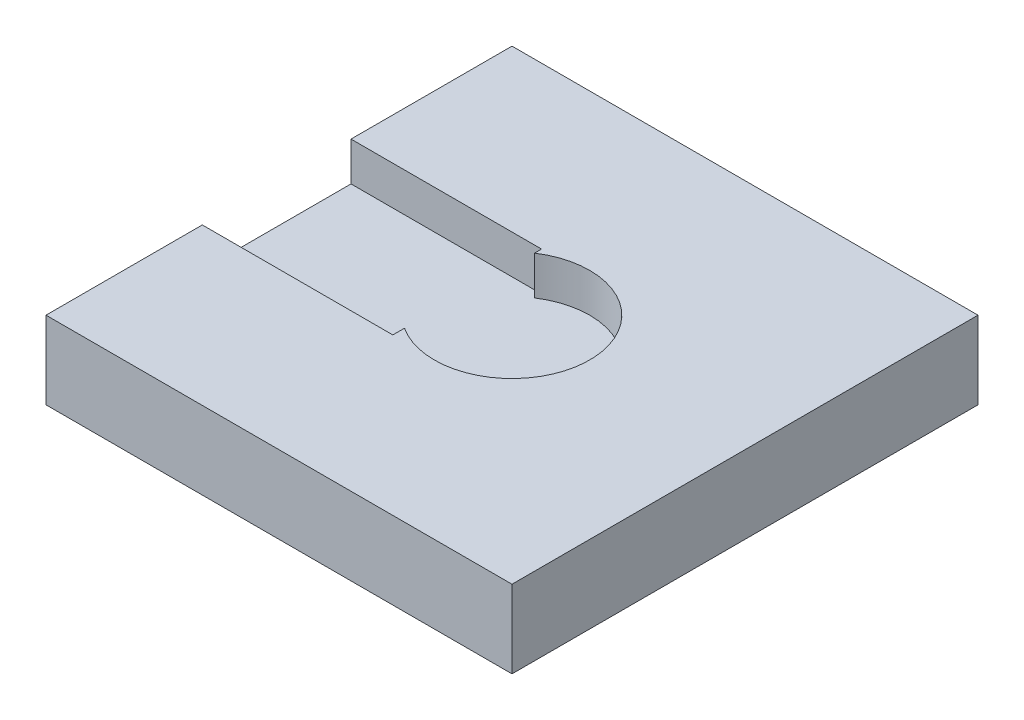
ISO-10303-21;
HEADER;
FILE_DESCRIPTION(('STEP AP214'),'2;1');
FILE_NAME('part.step','',(''),(''),'','','');
FILE_SCHEMA(('AUTOMOTIVE_DESIGN { 1 0 10303 214 1 1 1 1 }'));
ENDSEC;
DATA;
#1=APPLICATION_CONTEXT('core data for automotive mechanical design processes');
#2=APPLICATION_PROTOCOL_DEFINITION('international standard','automotive_design',2000,#1);
#3=PRODUCT_CONTEXT('',#1,'mechanical');
#4=PRODUCT('Part','Part','',(#3));
#5=PRODUCT_RELATED_PRODUCT_CATEGORY('part','',(#4));
#6=PRODUCT_DEFINITION_FORMATION('','',#4);
#7=PRODUCT_DEFINITION_CONTEXT('part definition',#1,'design');
#8=PRODUCT_DEFINITION('design','',#6,#7);
#9=PRODUCT_DEFINITION_SHAPE('','',#8);
#10=(LENGTH_UNIT() NAMED_UNIT(*) SI_UNIT(.MILLI.,.METRE.));
#11=(NAMED_UNIT(*) PLANE_ANGLE_UNIT() SI_UNIT($,.RADIAN.));
#12=(NAMED_UNIT(*) SI_UNIT($,.STERADIAN.) SOLID_ANGLE_UNIT());
#13=UNCERTAINTY_MEASURE_WITH_UNIT(LENGTH_MEASURE(1.E-05),#10,'distance_accuracy_value','');
#14=(GEOMETRIC_REPRESENTATION_CONTEXT(3) GLOBAL_UNCERTAINTY_ASSIGNED_CONTEXT((#13)) GLOBAL_UNIT_ASSIGNED_CONTEXT((#10,
#11,#12)) REPRESENTATION_CONTEXT('',''));
#15=CARTESIAN_POINT('',(0.,0.,0.));
#16=DIRECTION('',(0.,0.,1.));
#17=DIRECTION('',(1.,0.,0.));
#18=AXIS2_PLACEMENT_3D('',#15,#16,#17);
#19=CARTESIAN_POINT('',(30.,10.,-30.));
#20=DIRECTION('',(-1.,0.,0.));
#21=DIRECTION('',(0.,0.,1.));
#22=AXIS2_PLACEMENT_3D('',#19,#20,#21);
#23=PLANE('',#22);
#24=DIRECTION('',(0.,0.,-1.));
#25=VECTOR('',#24,1.);
#26=CARTESIAN_POINT('',(30.,0.,-30.));
#27=LINE('',#26,#25);
#28=CARTESIAN_POINT('',(30.,0.,30.));
#29=VERTEX_POINT('',#28);
#30=CARTESIAN_POINT('',(30.,0.,-30.));
#31=VERTEX_POINT('',#30);
#32=EDGE_CURVE('E164',#29,#31,#27,.T.);
#33=ORIENTED_EDGE('',*,*,#32,.T.);
#34=DIRECTION('',(0.,-1.,0.));
#35=VECTOR('',#34,1.);
#36=CARTESIAN_POINT('',(30.,10.,-30.));
#37=LINE('',#36,#35);
#38=CARTESIAN_POINT('',(30.,10.,-30.));
#39=VERTEX_POINT('',#38);
#40=EDGE_CURVE('E11',#39,#31,#37,.T.);
#41=ORIENTED_EDGE('',*,*,#40,.F.);
#42=DIRECTION('',(0.,0.,-1.));
#43=VECTOR('',#42,1.);
#44=CARTESIAN_POINT('',(30.,10.,-30.));
#45=LINE('',#44,#43);
#46=CARTESIAN_POINT('',(30.,10.,30.));
#47=VERTEX_POINT('',#46);
#48=EDGE_CURVE('E167',#47,#39,#45,.T.);
#49=ORIENTED_EDGE('',*,*,#48,.F.);
#50=DIRECTION('',(0.,-1.,0.));
#51=VECTOR('',#50,1.);
#52=CARTESIAN_POINT('',(30.,10.,30.));
#53=LINE('',#52,#51);
#54=EDGE_CURVE('E175',#47,#29,#53,.T.);
#55=ORIENTED_EDGE('',*,*,#54,.T.);
#56=EDGE_LOOP('',(#33,#41,#49,#55));
#57=FACE_BOUND('',#56,.T.);
#58=ADVANCED_FACE('F32',(#57),#23,.F.);
#59=CARTESIAN_POINT('',(-30.,10.,-30.));
#60=DIRECTION('',(0.,0.,1.));
#61=DIRECTION('',(1.,0.,0.));
#62=AXIS2_PLACEMENT_3D('',#59,#60,#61);
#63=PLANE('',#62);
#64=DIRECTION('',(-1.,0.,0.));
#65=VECTOR('',#64,1.);
#66=CARTESIAN_POINT('',(-30.,0.,-30.));
#67=LINE('',#66,#65);
#68=CARTESIAN_POINT('',(-30.,0.,-30.));
#69=VERTEX_POINT('',#68);
#70=EDGE_CURVE('E178',#31,#69,#67,.T.);
#71=ORIENTED_EDGE('',*,*,#70,.T.);
#72=DIRECTION('',(0.,-1.,0.));
#73=VECTOR('',#72,1.);
#74=CARTESIAN_POINT('',(-30.,10.,-30.));
#75=LINE('',#74,#73);
#76=CARTESIAN_POINT('',(-30.,10.,-30.));
#77=VERTEX_POINT('',#76);
#78=EDGE_CURVE('E39',#77,#69,#75,.T.);
#79=ORIENTED_EDGE('',*,*,#78,.F.);
#80=DIRECTION('',(-1.,0.,0.));
#81=VECTOR('',#80,1.);
#82=CARTESIAN_POINT('',(-30.,10.,-30.));
#83=LINE('',#82,#81);
#84=EDGE_CURVE('E83',#39,#77,#83,.T.);
#85=ORIENTED_EDGE('',*,*,#84,.F.);
#86=ORIENTED_EDGE('',*,*,#40,.T.);
#87=EDGE_LOOP('',(#71,#79,#85,#86));
#88=FACE_BOUND('',#87,.T.);
#89=ADVANCED_FACE('F221',(#88),#63,.F.);
#90=CARTESIAN_POINT('',(-30.,10.,-30.));
#91=DIRECTION('',(1.,0.,0.));
#92=DIRECTION('',(0.,0.,-1.));
#93=AXIS2_PLACEMENT_3D('',#90,#91,#92);
#94=PLANE('',#93);
#95=DIRECTION('',(0.,0.,1.));
#96=VECTOR('',#95,1.);
#97=CARTESIAN_POINT('',(-30.,10.,-30.));
#98=LINE('',#97,#96);
#99=CARTESIAN_POINT('',(-30.,10.,9.87566437744077));
#100=VERTEX_POINT('',#99);
#101=CARTESIAN_POINT('',(-30.,10.,30.));
#102=VERTEX_POINT('',#101);
#103=EDGE_CURVE('E170',#100,#102,#98,.T.);
#104=ORIENTED_EDGE('',*,*,#103,.F.);
#105=DIRECTION('',(0.,1.,0.));
#106=VECTOR('',#105,1.);
#107=CARTESIAN_POINT('',(-30.,5.,9.87566437744077));
#108=LINE('',#107,#106);
#109=CARTESIAN_POINT('',(-30.,5.,9.87566437744077));
#110=VERTEX_POINT('',#109);
#111=EDGE_CURVE('E155',#110,#100,#108,.T.);
#112=ORIENTED_EDGE('',*,*,#111,.F.);
#113=DIRECTION('',(0.,0.,1.));
#114=VECTOR('',#113,1.);
#115=CARTESIAN_POINT('',(-30.,5.,-9.27136218708064));
#116=LINE('',#115,#114);
#117=CARTESIAN_POINT('',(-30.,5.,-9.27136218708064));
#118=VERTEX_POINT('',#117);
#119=EDGE_CURVE('E141',#118,#110,#116,.T.);
#120=ORIENTED_EDGE('',*,*,#119,.F.);
#121=DIRECTION('',(0.,1.,0.));
#122=VECTOR('',#121,1.);
#123=CARTESIAN_POINT('',(-30.,5.,-9.27136218708064));
#124=LINE('',#123,#122);
#125=CARTESIAN_POINT('',(-30.,10.,-9.27136218708064));
#126=VERTEX_POINT('',#125);
#127=EDGE_CURVE('E136',#118,#126,#124,.T.);
#128=ORIENTED_EDGE('',*,*,#127,.T.);
#129=EDGE_CURVE('E171',#77,#126,#98,.T.);
#130=ORIENTED_EDGE('',*,*,#129,.F.);
#131=ORIENTED_EDGE('',*,*,#78,.T.);
#132=DIRECTION('',(0.,0.,1.));
#133=VECTOR('',#132,1.);
#134=CARTESIAN_POINT('',(-30.,0.,-30.));
#135=LINE('',#134,#133);
#136=CARTESIAN_POINT('',(-30.,0.,30.));
#137=VERTEX_POINT('',#136);
#138=EDGE_CURVE('E180',#69,#137,#135,.T.);
#139=ORIENTED_EDGE('',*,*,#138,.T.);
#140=DIRECTION('',(0.,-1.,0.));
#141=VECTOR('',#140,1.);
#142=CARTESIAN_POINT('',(-30.,10.,30.));
#143=LINE('',#142,#141);
#144=EDGE_CURVE('E184',#102,#137,#143,.T.);
#145=ORIENTED_EDGE('',*,*,#144,.F.);
#146=EDGE_LOOP('',(#104,#112,#120,#128,#130,#131,#139,#145));
#147=FACE_BOUND('',#146,.T.);
#148=ADVANCED_FACE('F190',(#147),#94,.F.);
#149=CARTESIAN_POINT('',(-30.,10.,30.));
#150=DIRECTION('',(0.,0.,-1.));
#151=DIRECTION('',(-1.,0.,0.));
#152=AXIS2_PLACEMENT_3D('',#149,#150,#151);
#153=PLANE('',#152);
#154=DIRECTION('',(1.,0.,0.));
#155=VECTOR('',#154,1.);
#156=CARTESIAN_POINT('',(-30.,0.,30.));
#157=LINE('',#156,#155);
#158=EDGE_CURVE('E76',#137,#29,#157,.T.);
#159=ORIENTED_EDGE('',*,*,#158,.T.);
#160=ORIENTED_EDGE('',*,*,#54,.F.);
#161=DIRECTION('',(1.,0.,0.));
#162=VECTOR('',#161,1.);
#163=CARTESIAN_POINT('',(-30.,10.,30.));
#164=LINE('',#163,#162);
#165=EDGE_CURVE('E55',#102,#47,#164,.T.);
#166=ORIENTED_EDGE('',*,*,#165,.F.);
#167=ORIENTED_EDGE('',*,*,#144,.T.);
#168=EDGE_LOOP('',(#159,#160,#166,#167));
#169=FACE_BOUND('',#168,.T.);
#170=ADVANCED_FACE('F198',(#169),#153,.F.);
#171=CARTESIAN_POINT('',(0.,10.,0.));
#172=DIRECTION('',(0.,1.,0.));
#173=DIRECTION('',(0.,0.,1.));
#174=AXIS2_PLACEMENT_3D('',#171,#172,#173);
#175=PLANE('',#174);
#176=DIRECTION('',(0.,0.,-1.));
#177=VECTOR('',#176,1.);
#178=CARTESIAN_POINT('',(-5.46750225548434,10.,-9.27136218708064));
#179=LINE('',#178,#177);
#180=CARTESIAN_POINT('',(-5.46750225548434,10.,9.87566437744077));
#181=VERTEX_POINT('',#180);
#182=CARTESIAN_POINT('',(-5.46750225548434,10.,8.37295760685993));
#183=VERTEX_POINT('',#182);
#184=EDGE_CURVE('E146',#181,#183,#179,.T.);
#185=ORIENTED_EDGE('',*,*,#184,.F.);
#186=DIRECTION('',(1.,0.,0.));
#187=VECTOR('',#186,1.);
#188=CARTESIAN_POINT('',(-5.46750225548434,10.,9.87566437744077));
#189=LINE('',#188,#187);
#190=EDGE_CURVE('E127',#100,#181,#189,.T.);
#191=ORIENTED_EDGE('',*,*,#190,.F.);
#192=ORIENTED_EDGE('',*,*,#103,.T.);
#193=ORIENTED_EDGE('',*,*,#165,.T.);
#194=ORIENTED_EDGE('',*,*,#48,.T.);
#195=ORIENTED_EDGE('',*,*,#84,.T.);
#196=ORIENTED_EDGE('',*,*,#129,.T.);
#197=DIRECTION('',(-1.,0.,0.));
#198=VECTOR('',#197,1.);
#199=CARTESIAN_POINT('',(-5.46750225548434,10.,-9.27136218708064));
#200=LINE('',#199,#198);
#201=CARTESIAN_POINT('',(-5.46750225548434,10.,-9.27136218708064));
#202=VERTEX_POINT('',#201);
#203=EDGE_CURVE('E148',#202,#126,#200,.T.);
#204=ORIENTED_EDGE('',*,*,#203,.F.);
#205=CARTESIAN_POINT('',(-5.46750225548434,10.,-8.37295760685993));
#206=VERTEX_POINT('',#205);
#207=EDGE_CURVE('E133',#206,#202,#179,.T.);
#208=ORIENTED_EDGE('',*,*,#207,.F.);
#209=CARTESIAN_POINT('',(0.,10.,0.));
#210=DIRECTION('',(0.,1.,0.));
#211=DIRECTION('',(0.,0.,1.));
#212=AXIS2_PLACEMENT_3D('',#209,#210,#211);
#213=CIRCLE('',#212,10.);
#214=EDGE_CURVE('E162',#183,#206,#213,.T.);
#215=ORIENTED_EDGE('',*,*,#214,.F.);
#216=EDGE_LOOP('',(#185,#191,#192,#193,#194,#195,#196,#204,#208,#215));
#217=FACE_BOUND('',#216,.T.);
#218=ADVANCED_FACE('F202',(#217),#175,.T.);
#219=CARTESIAN_POINT('',(0.,0.,0.));
#220=DIRECTION('',(0.,1.,0.));
#221=DIRECTION('',(0.,0.,1.));
#222=AXIS2_PLACEMENT_3D('',#219,#220,#221);
#223=PLANE('',#222);
#224=ORIENTED_EDGE('',*,*,#32,.F.);
#225=ORIENTED_EDGE('',*,*,#158,.F.);
#226=ORIENTED_EDGE('',*,*,#138,.F.);
#227=ORIENTED_EDGE('',*,*,#70,.F.);
#228=EDGE_LOOP('',(#224,#225,#226,#227));
#229=FACE_BOUND('',#228,.T.);
#230=ADVANCED_FACE('F194',(#229),#223,.F.);
#231=CARTESIAN_POINT('',(0.,5.,0.));
#232=DIRECTION('',(0.,1.,0.));
#233=DIRECTION('',(0.,0.,1.));
#234=AXIS2_PLACEMENT_3D('',#231,#232,#233);
#235=CYLINDRICAL_SURFACE('',#234,10.);
#236=ORIENTED_EDGE('',*,*,#214,.T.);
#237=DIRECTION('',(0.,1.,0.));
#238=VECTOR('',#237,1.);
#239=CARTESIAN_POINT('',(-5.46750225548434,5.,-8.37295760685993));
#240=LINE('',#239,#238);
#241=CARTESIAN_POINT('',(-5.46750225548434,5.,-8.37295760685993));
#242=VERTEX_POINT('',#241);
#243=EDGE_CURVE('E160',#206,#242,#240,.F.);
#244=ORIENTED_EDGE('',*,*,#243,.T.);
#245=CARTESIAN_POINT('',(0.,5.,0.));
#246=DIRECTION('',(0.,1.,0.));
#247=DIRECTION('',(0.,0.,1.));
#248=AXIS2_PLACEMENT_3D('',#245,#246,#247);
#249=CIRCLE('',#248,10.);
#250=CARTESIAN_POINT('',(-5.46750225548434,5.,8.37295760685993));
#251=VERTEX_POINT('',#250);
#252=EDGE_CURVE('E124',#251,#242,#249,.T.);
#253=ORIENTED_EDGE('',*,*,#252,.F.);
#254=DIRECTION('',(0.,1.,0.));
#255=VECTOR('',#254,1.);
#256=CARTESIAN_POINT('',(-5.46750225548434,5.,8.37295760685993));
#257=LINE('',#256,#255);
#258=EDGE_CURVE('E154',#251,#183,#257,.T.);
#259=ORIENTED_EDGE('',*,*,#258,.T.);
#260=EDGE_LOOP('',(#236,#244,#253,#259));
#261=FACE_BOUND('',#260,.T.);
#262=ADVANCED_FACE('F208',(#261),#235,.F.);
#263=CARTESIAN_POINT('',(0.,5.,0.));
#264=DIRECTION('',(0.,1.,0.));
#265=DIRECTION('',(0.,0.,1.));
#266=AXIS2_PLACEMENT_3D('',#263,#264,#265);
#267=PLANE('',#266);
#268=ORIENTED_EDGE('',*,*,#252,.T.);
#269=DIRECTION('',(0.,0.,-1.));
#270=VECTOR('',#269,1.);
#271=CARTESIAN_POINT('',(-5.46750225548434,5.,-9.27136218708064));
#272=LINE('',#271,#270);
#273=CARTESIAN_POINT('',(-5.46750225548434,5.,-9.27136218708064));
#274=VERTEX_POINT('',#273);
#275=EDGE_CURVE('E117',#242,#274,#272,.T.);
#276=ORIENTED_EDGE('',*,*,#275,.T.);
#277=DIRECTION('',(-1.,0.,0.));
#278=VECTOR('',#277,1.);
#279=CARTESIAN_POINT('',(-5.46750225548434,5.,-9.27136218708064));
#280=LINE('',#279,#278);
#281=EDGE_CURVE('E121',#274,#118,#280,.T.);
#282=ORIENTED_EDGE('',*,*,#281,.T.);
#283=ORIENTED_EDGE('',*,*,#119,.T.);
#284=DIRECTION('',(1.,0.,0.));
#285=VECTOR('',#284,1.);
#286=CARTESIAN_POINT('',(-5.46750225548434,5.,9.87566437744077));
#287=LINE('',#286,#285);
#288=CARTESIAN_POINT('',(-5.46750225548434,5.,9.87566437744077));
#289=VERTEX_POINT('',#288);
#290=EDGE_CURVE('E137',#110,#289,#287,.T.);
#291=ORIENTED_EDGE('',*,*,#290,.T.);
#292=EDGE_CURVE('E46',#289,#251,#272,.T.);
#293=ORIENTED_EDGE('',*,*,#292,.T.);
#294=EDGE_LOOP('',(#268,#276,#282,#283,#291,#293));
#295=FACE_BOUND('',#294,.T.);
#296=ADVANCED_FACE('F119',(#295),#267,.T.);
#297=CARTESIAN_POINT('',(-5.46750225548434,5.,-9.27136218708064));
#298=DIRECTION('',(1.,0.,0.));
#299=DIRECTION('',(0.,0.,-1.));
#300=AXIS2_PLACEMENT_3D('',#297,#298,#299);
#301=PLANE('',#300);
#302=ORIENTED_EDGE('',*,*,#207,.T.);
#303=DIRECTION('',(0.,1.,0.));
#304=VECTOR('',#303,1.);
#305=CARTESIAN_POINT('',(-5.46750225548434,5.,-9.27136218708064));
#306=LINE('',#305,#304);
#307=EDGE_CURVE('E130',#274,#202,#306,.T.);
#308=ORIENTED_EDGE('',*,*,#307,.F.);
#309=ORIENTED_EDGE('',*,*,#275,.F.);
#310=ORIENTED_EDGE('',*,*,#243,.F.);
#311=EDGE_LOOP('',(#302,#308,#309,#310));
#312=FACE_BOUND('',#311,.T.);
#313=ADVANCED_FACE('F131',(#312),#301,.F.);
#314=ORIENTED_EDGE('',*,*,#292,.F.);
#315=DIRECTION('',(0.,1.,0.));
#316=VECTOR('',#315,1.);
#317=CARTESIAN_POINT('',(-5.46750225548434,5.,9.87566437744077));
#318=LINE('',#317,#316);
#319=EDGE_CURVE('E152',#289,#181,#318,.T.);
#320=ORIENTED_EDGE('',*,*,#319,.T.);
#321=ORIENTED_EDGE('',*,*,#184,.T.);
#322=ORIENTED_EDGE('',*,*,#258,.F.);
#323=EDGE_LOOP('',(#314,#320,#321,#322));
#324=FACE_BOUND('',#323,.T.);
#325=ADVANCED_FACE('F210',(#324),#301,.F.);
#326=CARTESIAN_POINT('',(-5.46750225548434,5.,9.87566437744077));
#327=DIRECTION('',(0.,0.,1.));
#328=DIRECTION('',(1.,0.,0.));
#329=AXIS2_PLACEMENT_3D('',#326,#327,#328);
#330=PLANE('',#329);
#331=ORIENTED_EDGE('',*,*,#190,.T.);
#332=ORIENTED_EDGE('',*,*,#319,.F.);
#333=ORIENTED_EDGE('',*,*,#290,.F.);
#334=ORIENTED_EDGE('',*,*,#111,.T.);
#335=EDGE_LOOP('',(#331,#332,#333,#334));
#336=FACE_BOUND('',#335,.T.);
#337=ADVANCED_FACE('F205',(#336),#330,.F.);
#338=CARTESIAN_POINT('',(-5.46750225548434,5.,-9.27136218708064));
#339=DIRECTION('',(0.,0.,-1.));
#340=DIRECTION('',(-1.,0.,0.));
#341=AXIS2_PLACEMENT_3D('',#338,#339,#340);
#342=PLANE('',#341);
#343=ORIENTED_EDGE('',*,*,#203,.T.);
#344=ORIENTED_EDGE('',*,*,#127,.F.);
#345=ORIENTED_EDGE('',*,*,#281,.F.);
#346=ORIENTED_EDGE('',*,*,#307,.T.);
#347=EDGE_LOOP('',(#343,#344,#345,#346));
#348=FACE_BOUND('',#347,.T.);
#349=ADVANCED_FACE('F139',(#348),#342,.F.);
#350=CLOSED_SHELL('',(#58,#89,#148,#170,#218,#230,#262,#296,#313,#325,#337,#349));
#351=MANIFOLD_SOLID_BREP('B2',#350);
#352=ADVANCED_BREP_SHAPE_REPRESENTATION('',(#18,#351),#14);
#353=SHAPE_DEFINITION_REPRESENTATION(#9,#352);
ENDSEC;
END-ISO-10303-21;
